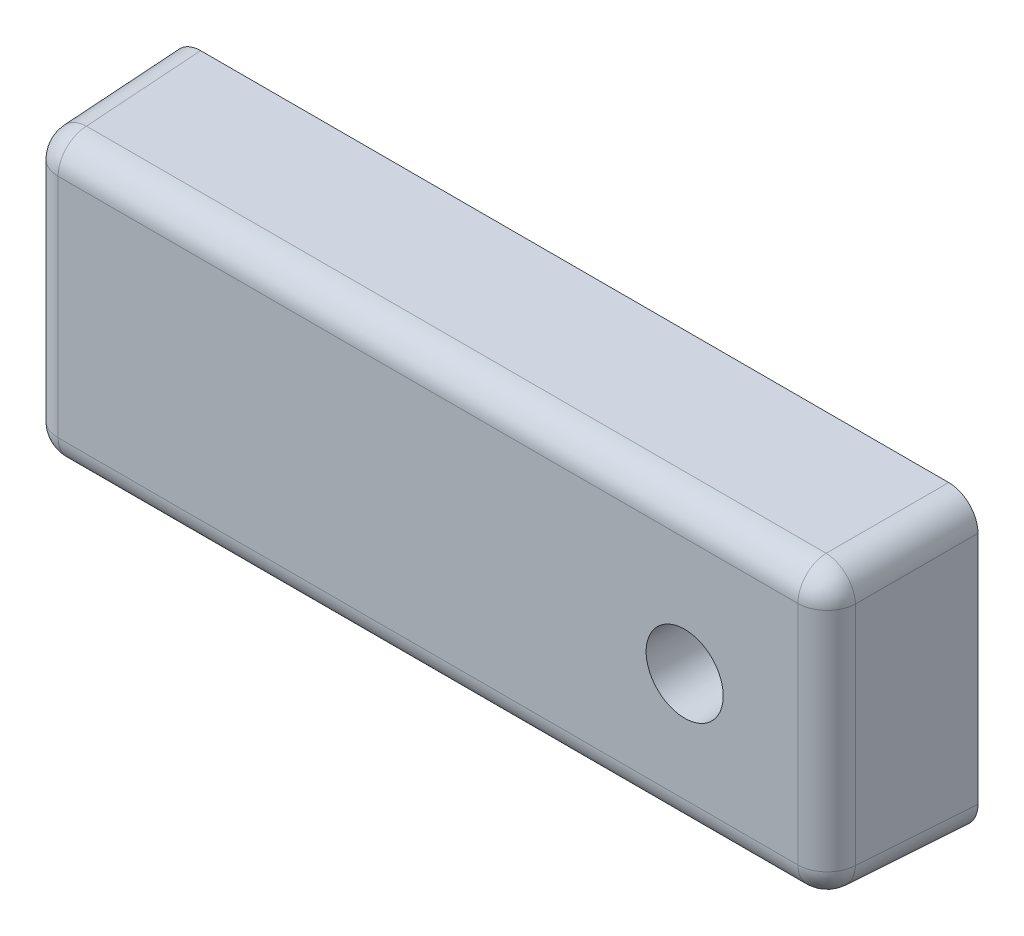
ISO-10303-21;
HEADER;
FILE_DESCRIPTION(('STEP AP214'),'2;1');
FILE_NAME('part.step','',(''),(''),'','','');
FILE_SCHEMA(('AUTOMOTIVE_DESIGN { 1 0 10303 214 1 1 1 1 }'));
ENDSEC;
DATA;
#1=APPLICATION_CONTEXT('core data for automotive mechanical design processes');
#2=APPLICATION_PROTOCOL_DEFINITION('international standard','automotive_design',2000,#1);
#3=PRODUCT_CONTEXT('',#1,'mechanical');
#4=PRODUCT('Part','Part','',(#3));
#5=PRODUCT_RELATED_PRODUCT_CATEGORY('part','',(#4));
#6=PRODUCT_DEFINITION_FORMATION('','',#4);
#7=PRODUCT_DEFINITION_CONTEXT('part definition',#1,'design');
#8=PRODUCT_DEFINITION('design','',#6,#7);
#9=PRODUCT_DEFINITION_SHAPE('','',#8);
#10=(LENGTH_UNIT() NAMED_UNIT(*) SI_UNIT(.MILLI.,.METRE.));
#11=(NAMED_UNIT(*) PLANE_ANGLE_UNIT() SI_UNIT($,.RADIAN.));
#12=(NAMED_UNIT(*) SI_UNIT($,.STERADIAN.) SOLID_ANGLE_UNIT());
#13=UNCERTAINTY_MEASURE_WITH_UNIT(LENGTH_MEASURE(1.E-05),#10,'distance_accuracy_value','');
#14=(GEOMETRIC_REPRESENTATION_CONTEXT(3) GLOBAL_UNCERTAINTY_ASSIGNED_CONTEXT((#13)) GLOBAL_UNIT_ASSIGNED_CONTEXT((#10,
#11,#12)) REPRESENTATION_CONTEXT('',''));
#15=CARTESIAN_POINT('',(0.,0.,0.));
#16=DIRECTION('',(0.,0.,1.));
#17=DIRECTION('',(1.,0.,0.));
#18=AXIS2_PLACEMENT_3D('',#15,#16,#17);
#19=CARTESIAN_POINT('',(0.,0.,10.));
#20=DIRECTION('',(0.,0.,1.));
#21=DIRECTION('',(1.,0.,0.));
#22=AXIS2_PLACEMENT_3D('',#19,#20,#21);
#23=PLANE('',#22);
#24=DIRECTION('',(0.,1.,0.));
#25=VECTOR('',#24,1.);
#26=CARTESIAN_POINT('',(-65.7194147554684,3.09968367996677,10.));
#27=LINE('',#26,#25);
#28=CARTESIAN_POINT('',(-65.7194147554684,20.4698907405177,10.));
#29=VERTEX_POINT('',#28);
#30=CARTESIAN_POINT('',(-65.7194147554684,5.03106122958092,10.));
#31=VERTEX_POINT('',#30);
#32=EDGE_CURVE('E149',#29,#31,#27,.F.);
#33=ORIENTED_EDGE('',*,*,#32,.T.);
#34=DIRECTION('',(-1.,0.,0.));
#35=VECTOR('',#34,1.);
#36=CARTESIAN_POINT('',(-13.3492076949175,5.03106122958093,10.));
#37=LINE('',#36,#35);
#38=CARTESIAN_POINT('',(-15.2805852445316,5.03106122958093,10.));
#39=VERTEX_POINT('',#38);
#40=EDGE_CURVE('E148',#31,#39,#37,.F.);
#41=ORIENTED_EDGE('',*,*,#40,.T.);
#42=DIRECTION('',(0.,-1.,0.));
#43=VECTOR('',#42,1.);
#44=CARTESIAN_POINT('',(-15.2805852445316,22.4012682901318,10.));
#45=LINE('',#44,#43);
#46=CARTESIAN_POINT('',(-15.2805852445316,20.4698907405177,10.));
#47=VERTEX_POINT('',#46);
#48=EDGE_CURVE('E135',#39,#47,#45,.F.);
#49=ORIENTED_EDGE('',*,*,#48,.T.);
#50=DIRECTION('',(1.,0.,0.));
#51=VECTOR('',#50,1.);
#52=CARTESIAN_POINT('',(-67.6507923050825,20.4698907405177,10.));
#53=LINE('',#52,#51);
#54=EDGE_CURVE('E145',#47,#29,#53,.F.);
#55=ORIENTED_EDGE('',*,*,#54,.T.);
#56=EDGE_LOOP('',(#33,#41,#49,#55));
#57=FACE_BOUND('',#56,.T.);
#58=CARTESIAN_POINT('',(-22.999786699697,12.458174308326,10.));
#59=DIRECTION('',(0.,0.,1.));
#60=DIRECTION('',(1.,0.,0.));
#61=AXIS2_PLACEMENT_3D('',#58,#59,#60);
#62=CIRCLE('',#61,2.62840366853749);
#63=CARTESIAN_POINT('',(-20.3713830311595,12.458174308326,10.));
#64=VERTEX_POINT('',#63);
#65=EDGE_CURVE('E159',#64,#64,#62,.T.);
#66=ORIENTED_EDGE('',*,*,#65,.F.);
#67=EDGE_LOOP('',(#66));
#68=FACE_BOUND('',#67,.T.);
#69=ADVANCED_FACE('F37',(#57,#68),#23,.T.);
#70=CARTESIAN_POINT('',(0.,0.,0.));
#71=DIRECTION('',(0.,0.,1.));
#72=DIRECTION('',(1.,0.,0.));
#73=AXIS2_PLACEMENT_3D('',#70,#71,#72);
#74=PLANE('',#73);
#75=DIRECTION('',(-1.,0.,0.));
#76=VECTOR('',#75,1.);
#77=CARTESIAN_POINT('',(-13.,22.7504759850493,0.));
#78=LINE('',#77,#76);
#79=CARTESIAN_POINT('',(-14.9987816540382,22.7504759850493,0.));
#80=VERTEX_POINT('',#79);
#81=CARTESIAN_POINT('',(-66.0012183459618,22.7504759850493,0.));
#82=VERTEX_POINT('',#81);
#83=EDGE_CURVE('E243',#80,#82,#78,.T.);
#84=ORIENTED_EDGE('',*,*,#83,.F.);
#85=CARTESIAN_POINT('',(-15.0012190885976,20.7492568964517,0.));
#86=DIRECTION('',(0.,0.,1.));
#87=DIRECTION('',(0.707106781186547,0.707106781186548,0.));
#88=AXIS2_PLACEMENT_3D('',#85,#86,#87);
#89=ELLIPSE('',#88,2.00243743501143,2.);
#90=CARTESIAN_POINT('',(-13.,20.7516943310111,0.));
#91=VERTEX_POINT('',#90);
#92=EDGE_CURVE('E192',#80,#91,#89,.F.);
#93=ORIENTED_EDGE('',*,*,#92,.T.);
#94=DIRECTION('',(0.,1.,0.));
#95=VECTOR('',#94,1.);
#96=CARTESIAN_POINT('',(-13.,2.7504759850493,0.));
#97=LINE('',#96,#95);
#98=CARTESIAN_POINT('',(-13.,4.74925763908749,0.));
#99=VERTEX_POINT('',#98);
#100=EDGE_CURVE('E234',#99,#91,#97,.T.);
#101=ORIENTED_EDGE('',*,*,#100,.F.);
#102=CARTESIAN_POINT('',(-15.0012190885976,4.75169507364695,0.));
#103=DIRECTION('',(0.,0.,1.));
#104=DIRECTION('',(0.707106781186548,-0.707106781186547,0.));
#105=AXIS2_PLACEMENT_3D('',#102,#103,#104);
#106=ELLIPSE('',#105,2.00243743501143,2.);
#107=CARTESIAN_POINT('',(-14.9987816540382,2.7504759850493,0.));
#108=VERTEX_POINT('',#107);
#109=EDGE_CURVE('E188',#99,#108,#106,.F.);
#110=ORIENTED_EDGE('',*,*,#109,.T.);
#111=DIRECTION('',(1.,0.,0.));
#112=VECTOR('',#111,1.);
#113=CARTESIAN_POINT('',(-13.,2.7504759850493,0.));
#114=LINE('',#113,#112);
#115=CARTESIAN_POINT('',(-66.0012183459618,2.7504759850493,0.));
#116=VERTEX_POINT('',#115);
#117=EDGE_CURVE('E153',#116,#108,#114,.T.);
#118=ORIENTED_EDGE('',*,*,#117,.F.);
#119=CARTESIAN_POINT('',(-65.9987809114023,4.75169507364694,0.));
#120=DIRECTION('',(0.,0.,1.));
#121=DIRECTION('',(-0.707106781186547,-0.707106781186548,0.));
#122=AXIS2_PLACEMENT_3D('',#119,#120,#121);
#123=ELLIPSE('',#122,2.00243743501143,2.);
#124=CARTESIAN_POINT('',(-68.,4.74925763908749,0.));
#125=VERTEX_POINT('',#124);
#126=EDGE_CURVE('E54',#116,#125,#123,.F.);
#127=ORIENTED_EDGE('',*,*,#126,.T.);
#128=DIRECTION('',(0.,-1.,0.));
#129=VECTOR('',#128,1.);
#130=CARTESIAN_POINT('',(-68.,2.7504759850493,0.));
#131=LINE('',#130,#129);
#132=CARTESIAN_POINT('',(-68.,20.7516943310111,0.));
#133=VERTEX_POINT('',#132);
#134=EDGE_CURVE('E156',#133,#125,#131,.T.);
#135=ORIENTED_EDGE('',*,*,#134,.F.);
#136=CARTESIAN_POINT('',(-65.9987809114024,20.7492568964517,0.));
#137=DIRECTION('',(0.,0.,1.));
#138=DIRECTION('',(-0.707106781186548,0.707106781186547,0.));
#139=AXIS2_PLACEMENT_3D('',#136,#137,#138);
#140=ELLIPSE('',#139,2.00243743501143,2.);
#141=EDGE_CURVE('E190',#133,#82,#140,.F.);
#142=ORIENTED_EDGE('',*,*,#141,.T.);
#143=EDGE_LOOP('',(#84,#93,#101,#110,#118,#127,#135,#142));
#144=FACE_BOUND('',#143,.T.);
#145=CARTESIAN_POINT('',(-22.999786699697,12.458174308326,0.));
#146=DIRECTION('',(0.,0.,1.));
#147=DIRECTION('',(1.,0.,0.));
#148=AXIS2_PLACEMENT_3D('',#145,#146,#147);
#149=CIRCLE('',#148,2.27919597362001);
#150=CARTESIAN_POINT('',(-20.720590726077,12.458174308326,0.));
#151=VERTEX_POINT('',#150);
#152=EDGE_CURVE('E203',#151,#151,#149,.T.);
#153=ORIENTED_EDGE('',*,*,#152,.T.);
#154=EDGE_LOOP('',(#153));
#155=FACE_BOUND('',#154,.T.);
#156=ADVANCED_FACE('F245',(#144,#155),#74,.F.);
#157=CARTESIAN_POINT('',(-13.,2.7504759850493,0.));
#158=DIRECTION('',(0.999390827019096,0.,0.034899496702501));
#159=DIRECTION('',(0.034899496702501,0.,-0.999390827019096));
#160=AXIS2_PLACEMENT_3D('',#157,#158,#159);
#161=PLANE('',#160);
#162=ORIENTED_EDGE('',*,*,#100,.T.);
#163=DIRECTION('',(-0.0348782627423747,-0.0348782627423747,0.998782765958718));
#164=VECTOR('',#163,1.);
#165=CARTESIAN_POINT('',(-13.0218983599243,20.7297959710869,0.627086981271629));
#166=LINE('',#165,#164);
#167=CARTESIAN_POINT('',(-13.2818035904934,20.4698907405177,8.069798993405));
#168=VERTEX_POINT('',#167);
#169=EDGE_CURVE('E196',#91,#168,#166,.T.);
#170=ORIENTED_EDGE('',*,*,#169,.T.);
#171=DIRECTION('',(0.,1.,0.));
#172=VECTOR('',#171,1.);
#173=CARTESIAN_POINT('',(-13.2818035904934,3.09968367996678,8.069798993405));
#174=LINE('',#173,#172);
#175=CARTESIAN_POINT('',(-13.2818035904934,5.03106122958093,8.069798993405));
#176=VERTEX_POINT('',#175);
#177=EDGE_CURVE('E138',#168,#176,#174,.F.);
#178=ORIENTED_EDGE('',*,*,#177,.T.);
#179=DIRECTION('',(-0.0348782627423747,0.0348782627423747,0.998782765958718));
#180=VECTOR('',#179,1.);
#181=CARTESIAN_POINT('',(-12.9975684956857,4.74682613477323,-0.069629173401649));
#182=LINE('',#181,#180);
#183=EDGE_CURVE('E194',#176,#99,#182,.F.);
#184=ORIENTED_EDGE('',*,*,#183,.T.);
#185=EDGE_LOOP('',(#162,#170,#178,#184));
#186=FACE_BOUND('',#185,.T.);
#187=ADVANCED_FACE('F231',(#186),#161,.T.);
#188=CARTESIAN_POINT('',(-13.,22.7504759850493,0.));
#189=DIRECTION('',(0.,0.999390827019096,0.034899496702501));
#190=DIRECTION('',(0.,-0.034899496702501,0.999390827019096));
#191=AXIS2_PLACEMENT_3D('',#188,#189,#190);
#192=PLANE('',#191);
#193=DIRECTION('',(-1.,0.,0.));
#194=VECTOR('',#193,1.);
#195=CARTESIAN_POINT('',(-13.3492076949175,22.4686723945559,8.069798993405));
#196=LINE('',#195,#194);
#197=CARTESIAN_POINT('',(-65.7194147554684,22.4686723945559,8.069798993405));
#198=VERTEX_POINT('',#197);
#199=CARTESIAN_POINT('',(-15.2805852445316,22.4686723945559,8.069798993405));
#200=VERTEX_POINT('',#199);
#201=EDGE_CURVE('E169',#198,#200,#196,.F.);
#202=ORIENTED_EDGE('',*,*,#201,.T.);
#203=DIRECTION('',(-0.0348782627423747,-0.0348782627423747,0.998782765958718));
#204=VECTOR('',#203,1.);
#205=CARTESIAN_POINT('',(-14.9963501497239,22.7529074893636,-0.0696291734016491));
#206=LINE('',#205,#204);
#207=EDGE_CURVE('E185',#200,#80,#206,.F.);
#208=ORIENTED_EDGE('',*,*,#207,.T.);
#209=ORIENTED_EDGE('',*,*,#83,.T.);
#210=DIRECTION('',(0.0348782627423747,-0.0348782627423746,0.998782765958718));
#211=VECTOR('',#210,1.);
#212=CARTESIAN_POINT('',(-65.9367427236201,22.6860003627076,1.84634025194986));
#213=LINE('',#212,#211);
#214=EDGE_CURVE('E183',#82,#198,#213,.T.);
#215=ORIENTED_EDGE('',*,*,#214,.T.);
#216=EDGE_LOOP('',(#202,#208,#209,#215));
#217=FACE_BOUND('',#216,.T.);
#218=ADVANCED_FACE('F242',(#217),#192,.T.);
#219=CARTESIAN_POINT('',(-68.,2.7504759850493,0.));
#220=DIRECTION('',(-0.999390827019096,0.,0.034899496702501));
#221=DIRECTION('',(0.034899496702501,0.,0.999390827019096));
#222=AXIS2_PLACEMENT_3D('',#219,#220,#221);
#223=PLANE('',#222);
#224=DIRECTION('',(0.,-1.,0.));
#225=VECTOR('',#224,1.);
#226=CARTESIAN_POINT('',(-67.7181964095066,22.4012682901318,8.069798993405));
#227=LINE('',#226,#225);
#228=CARTESIAN_POINT('',(-67.7181964095066,5.03106122958092,8.069798993405));
#229=VERTEX_POINT('',#228);
#230=CARTESIAN_POINT('',(-67.7181964095066,20.4698907405177,8.069798993405));
#231=VERTEX_POINT('',#230);
#232=EDGE_CURVE('E166',#229,#231,#227,.F.);
#233=ORIENTED_EDGE('',*,*,#232,.T.);
#234=DIRECTION('',(0.0348782627423747,-0.0348782627423747,0.998782765958718));
#235=VECTOR('',#234,1.);
#236=CARTESIAN_POINT('',(-67.9781016400757,20.7297959710868,0.627086981271628));
#237=LINE('',#236,#235);
#238=EDGE_CURVE('E61',#231,#133,#237,.F.);
#239=ORIENTED_EDGE('',*,*,#238,.T.);
#240=ORIENTED_EDGE('',*,*,#134,.T.);
#241=DIRECTION('',(0.0348782627423747,0.0348782627423747,0.998782765958718));
#242=VECTOR('',#241,1.);
#243=CARTESIAN_POINT('',(-68.0024315043143,4.74682613477323,-0.0696291734016491));
#244=LINE('',#243,#242);
#245=EDGE_CURVE('E198',#125,#229,#244,.T.);
#246=ORIENTED_EDGE('',*,*,#245,.T.);
#247=EDGE_LOOP('',(#233,#239,#240,#246));
#248=FACE_BOUND('',#247,.T.);
#249=ADVANCED_FACE('F270',(#248),#223,.T.);
#250=CARTESIAN_POINT('',(-13.,2.7504759850493,0.));
#251=DIRECTION('',(0.,-0.999390827019096,0.034899496702501));
#252=DIRECTION('',(0.,-0.034899496702501,-0.999390827019096));
#253=AXIS2_PLACEMENT_3D('',#250,#251,#252);
#254=PLANE('',#253);
#255=ORIENTED_EDGE('',*,*,#117,.T.);
#256=DIRECTION('',(-0.0348782627423747,0.0348782627423746,0.998782765958718));
#257=VECTOR('',#256,1.);
#258=CARTESIAN_POINT('',(-14.9963501497239,2.74804448073504,-0.0696291734016491));
#259=LINE('',#258,#257);
#260=CARTESIAN_POINT('',(-15.2805852445316,3.03227957554274,8.069798993405));
#261=VERTEX_POINT('',#260);
#262=EDGE_CURVE('E11',#108,#261,#259,.T.);
#263=ORIENTED_EDGE('',*,*,#262,.T.);
#264=DIRECTION('',(1.,0.,0.));
#265=VECTOR('',#264,1.);
#266=CARTESIAN_POINT('',(-67.6507923050825,3.03227957554273,8.069798993405));
#267=LINE('',#266,#265);
#268=CARTESIAN_POINT('',(-65.7194147554684,3.03227957554273,8.069798993405));
#269=VERTEX_POINT('',#268);
#270=EDGE_CURVE('E163',#261,#269,#267,.F.);
#271=ORIENTED_EDGE('',*,*,#270,.T.);
#272=DIRECTION('',(0.0348782627423747,0.0348782627423747,0.998782765958718));
#273=VECTOR('',#272,1.);
#274=CARTESIAN_POINT('',(-65.9367427236201,2.81495160739097,1.84634025194986));
#275=LINE('',#274,#273);
#276=EDGE_CURVE('E46',#269,#116,#275,.F.);
#277=ORIENTED_EDGE('',*,*,#276,.T.);
#278=EDGE_LOOP('',(#255,#263,#271,#277));
#279=FACE_BOUND('',#278,.T.);
#280=ADVANCED_FACE('F222',(#279),#254,.T.);
#281=CARTESIAN_POINT('',(-22.999786699697,12.458174308326,0.));
#282=DIRECTION('',(0.,0.,1.));
#283=DIRECTION('',(1.,0.,0.));
#284=AXIS2_PLACEMENT_3D('',#281,#282,#283);
#285=CONICAL_SURFACE('',#284,2.27919597362001,0.0349065850398866);
#286=ORIENTED_EDGE('',*,*,#65,.T.);
#287=EDGE_LOOP('',(#286));
#288=FACE_BOUND('',#287,.T.);
#289=ORIENTED_EDGE('',*,*,#152,.F.);
#290=EDGE_LOOP('',(#289));
#291=FACE_BOUND('',#290,.T.);
#292=ADVANCED_FACE('F257',(#288,#291),#285,.F.);
#293=CARTESIAN_POINT('',(0.,20.4698907405177,8.));
#294=DIRECTION('',(-1.,0.,0.));
#295=DIRECTION('',(0.,-1.,0.));
#296=AXIS2_PLACEMENT_3D('',#293,#294,#295);
#297=CYLINDRICAL_SURFACE('',#296,2.);
#298=ORIENTED_EDGE('',*,*,#54,.F.);
#299=CARTESIAN_POINT('',(-15.2805852445316,20.4698907405177,8.));
#300=DIRECTION('',(-1.,0.,0.));
#301=DIRECTION('',(0.,-1.,0.));
#302=AXIS2_PLACEMENT_3D('',#299,#300,#301);
#303=CIRCLE('',#302,2.);
#304=EDGE_CURVE('E117',#47,#200,#303,.T.);
#305=ORIENTED_EDGE('',*,*,#304,.T.);
#306=ORIENTED_EDGE('',*,*,#201,.F.);
#307=CARTESIAN_POINT('',(-65.7194147554683,20.4698907405177,8.));
#308=DIRECTION('',(-1.,0.,0.));
#309=DIRECTION('',(0.,-1.,0.));
#310=AXIS2_PLACEMENT_3D('',#307,#308,#309);
#311=CIRCLE('',#310,2.);
#312=EDGE_CURVE('E128',#198,#29,#311,.F.);
#313=ORIENTED_EDGE('',*,*,#312,.T.);
#314=EDGE_LOOP('',(#298,#305,#306,#313));
#315=FACE_BOUND('',#314,.T.);
#316=ADVANCED_FACE('F151',(#315),#297,.T.);
#317=CARTESIAN_POINT('',(-65.7194147554684,0.,8.));
#318=DIRECTION('',(0.,-1.,0.));
#319=DIRECTION('',(0.,0.,-1.));
#320=AXIS2_PLACEMENT_3D('',#317,#318,#319);
#321=CYLINDRICAL_SURFACE('',#320,2.);
#322=ORIENTED_EDGE('',*,*,#32,.F.);
#323=CARTESIAN_POINT('',(-65.7194147554684,20.4698907405177,8.));
#324=DIRECTION('',(0.,-1.,0.));
#325=DIRECTION('',(0.,0.,-1.));
#326=AXIS2_PLACEMENT_3D('',#323,#324,#325);
#327=CIRCLE('',#326,2.);
#328=EDGE_CURVE('E174',#29,#231,#327,.T.);
#329=ORIENTED_EDGE('',*,*,#328,.T.);
#330=ORIENTED_EDGE('',*,*,#232,.F.);
#331=CARTESIAN_POINT('',(-65.7194147554684,5.03106122958092,8.));
#332=DIRECTION('',(0.,-1.,0.));
#333=DIRECTION('',(0.,0.,-1.));
#334=AXIS2_PLACEMENT_3D('',#331,#332,#333);
#335=CIRCLE('',#334,2.);
#336=EDGE_CURVE('E127',#229,#31,#335,.F.);
#337=ORIENTED_EDGE('',*,*,#336,.T.);
#338=EDGE_LOOP('',(#322,#329,#330,#337));
#339=FACE_BOUND('',#338,.T.);
#340=ADVANCED_FACE('F281',(#339),#321,.T.);
#341=CARTESIAN_POINT('',(-15.2805852445316,0.,8.));
#342=DIRECTION('',(0.,1.,0.));
#343=DIRECTION('',(0.,0.,1.));
#344=AXIS2_PLACEMENT_3D('',#341,#342,#343);
#345=CYLINDRICAL_SURFACE('',#344,2.);
#346=ORIENTED_EDGE('',*,*,#177,.F.);
#347=CARTESIAN_POINT('',(-15.2805852445316,20.4698907405177,8.));
#348=DIRECTION('',(0.,1.,0.));
#349=DIRECTION('',(0.,0.,1.));
#350=AXIS2_PLACEMENT_3D('',#347,#348,#349);
#351=CIRCLE('',#350,2.);
#352=EDGE_CURVE('E120',#168,#47,#351,.F.);
#353=ORIENTED_EDGE('',*,*,#352,.T.);
#354=ORIENTED_EDGE('',*,*,#48,.F.);
#355=CARTESIAN_POINT('',(-15.2805852445316,5.03106122958093,8.));
#356=DIRECTION('',(0.,1.,0.));
#357=DIRECTION('',(0.,0.,1.));
#358=AXIS2_PLACEMENT_3D('',#355,#356,#357);
#359=CIRCLE('',#358,2.);
#360=EDGE_CURVE('E139',#39,#176,#359,.T.);
#361=ORIENTED_EDGE('',*,*,#360,.T.);
#362=EDGE_LOOP('',(#346,#353,#354,#361));
#363=FACE_BOUND('',#362,.T.);
#364=ADVANCED_FACE('F134',(#363),#345,.T.);
#365=CARTESIAN_POINT('',(0.,5.03106122958093,8.));
#366=DIRECTION('',(1.,0.,0.));
#367=DIRECTION('',(0.,1.,0.));
#368=AXIS2_PLACEMENT_3D('',#365,#366,#367);
#369=CYLINDRICAL_SURFACE('',#368,2.);
#370=ORIENTED_EDGE('',*,*,#270,.F.);
#371=CARTESIAN_POINT('',(-15.2805852445316,5.03106122958093,8.));
#372=DIRECTION('',(1.,0.,0.));
#373=DIRECTION('',(0.,1.,0.));
#374=AXIS2_PLACEMENT_3D('',#371,#372,#373);
#375=CIRCLE('',#374,2.);
#376=EDGE_CURVE('E180',#261,#39,#375,.F.);
#377=ORIENTED_EDGE('',*,*,#376,.T.);
#378=ORIENTED_EDGE('',*,*,#40,.F.);
#379=CARTESIAN_POINT('',(-65.7194147554684,5.03106122958092,8.));
#380=DIRECTION('',(1.,0.,0.));
#381=DIRECTION('',(0.,1.,0.));
#382=AXIS2_PLACEMENT_3D('',#379,#380,#381);
#383=CIRCLE('',#382,2.);
#384=EDGE_CURVE('E177',#31,#269,#383,.T.);
#385=ORIENTED_EDGE('',*,*,#384,.T.);
#386=EDGE_LOOP('',(#370,#377,#378,#385));
#387=FACE_BOUND('',#386,.T.);
#388=ADVANCED_FACE('F221',(#387),#369,.T.);
#389=CARTESIAN_POINT('',(-14.9963501497239,20.7541258353254,-0.139428166806651));
#390=DIRECTION('',(0.0348782627423747,0.0348782627423747,-0.998782765958718));
#391=DIRECTION('',(0.,0.999390827019096,0.034899496702501));
#392=AXIS2_PLACEMENT_3D('',#389,#390,#391);
#393=CYLINDRICAL_SURFACE('',#392,2.);
#394=ORIENTED_EDGE('',*,*,#92,.F.);
#395=ORIENTED_EDGE('',*,*,#207,.F.);
#396=CARTESIAN_POINT('',(-15.2805852445316,20.4698907405177,8.));
#397=DIRECTION('',(-0.0348782627423745,-0.0348782627423746,0.998782765958718));
#398=DIRECTION('',(0.,-0.999390827019096,-0.034899496702501));
#399=AXIS2_PLACEMENT_3D('',#396,#397,#398);
#400=CIRCLE('',#399,2.);
#401=EDGE_CURVE('E122',#168,#200,#400,.T.);
#402=ORIENTED_EDGE('',*,*,#401,.F.);
#403=ORIENTED_EDGE('',*,*,#169,.F.);
#404=EDGE_LOOP('',(#394,#395,#402,#403));
#405=FACE_BOUND('',#404,.T.);
#406=ADVANCED_FACE('F237',(#405),#393,.T.);
#407=CARTESIAN_POINT('',(-15.2805852445316,20.4698907405177,8.));
#408=DIRECTION('',(0.,0.,1.));
#409=DIRECTION('',(1.,0.,0.));
#410=AXIS2_PLACEMENT_3D('',#407,#408,#409);
#411=SPHERICAL_SURFACE('',#410,2.);
#412=ORIENTED_EDGE('',*,*,#401,.T.);
#413=ORIENTED_EDGE('',*,*,#304,.F.);
#414=ORIENTED_EDGE('',*,*,#352,.F.);
#415=EDGE_LOOP('',(#412,#413,#414));
#416=FACE_BOUND('',#415,.T.);
#417=ADVANCED_FACE('F119',(#416),#411,.T.);
#418=CARTESIAN_POINT('',(-65.9793199860376,20.7297959710868,0.557287987866626));
#419=DIRECTION('',(-0.0348782627423747,0.0348782627423747,-0.998782765958718));
#420=DIRECTION('',(-0.999390827019096,0.,0.034899496702501));
#421=AXIS2_PLACEMENT_3D('',#418,#419,#420);
#422=CYLINDRICAL_SURFACE('',#421,2.);
#423=ORIENTED_EDGE('',*,*,#141,.F.);
#424=ORIENTED_EDGE('',*,*,#238,.F.);
#425=CARTESIAN_POINT('',(-65.7194147554684,20.4698907405177,8.));
#426=DIRECTION('',(0.0348782627423746,-0.0348782627423745,0.998782765958718));
#427=DIRECTION('',(0.999390827019096,0.,-0.0348994967025009));
#428=AXIS2_PLACEMENT_3D('',#425,#426,#427);
#429=CIRCLE('',#428,2.);
#430=EDGE_CURVE('E204',#198,#231,#429,.T.);
#431=ORIENTED_EDGE('',*,*,#430,.F.);
#432=ORIENTED_EDGE('',*,*,#214,.F.);
#433=EDGE_LOOP('',(#423,#424,#431,#432));
#434=FACE_BOUND('',#433,.T.);
#435=ADVANCED_FACE('F289',(#434),#422,.T.);
#436=CARTESIAN_POINT('',(-65.7194147554684,20.4698907405177,8.));
#437=DIRECTION('',(0.,0.,1.));
#438=DIRECTION('',(1.,0.,0.));
#439=AXIS2_PLACEMENT_3D('',#436,#437,#438);
#440=SPHERICAL_SURFACE('',#439,2.);
#441=ORIENTED_EDGE('',*,*,#328,.F.);
#442=ORIENTED_EDGE('',*,*,#312,.F.);
#443=ORIENTED_EDGE('',*,*,#430,.T.);
#444=EDGE_LOOP('',(#441,#442,#443));
#445=FACE_BOUND('',#444,.T.);
#446=ADVANCED_FACE('F292',(#445),#440,.T.);
#447=CARTESIAN_POINT('',(-14.9963501497239,4.74682613477323,-0.139428166806651));
#448=DIRECTION('',(0.0348782627423747,-0.0348782627423747,-0.998782765958718));
#449=DIRECTION('',(-0.999390827019096,0.,-0.034899496702501));
#450=AXIS2_PLACEMENT_3D('',#447,#448,#449);
#451=CYLINDRICAL_SURFACE('',#450,2.);
#452=ORIENTED_EDGE('',*,*,#109,.F.);
#453=ORIENTED_EDGE('',*,*,#183,.F.);
#454=CARTESIAN_POINT('',(-15.2805852445316,5.03106122958093,8.));
#455=DIRECTION('',(-0.0348782627423745,0.0348782627423745,0.998782765958718));
#456=DIRECTION('',(0.,-0.999390827019096,0.0348994967025009));
#457=AXIS2_PLACEMENT_3D('',#454,#455,#456);
#458=CIRCLE('',#457,2.);
#459=EDGE_CURVE('E205',#261,#176,#458,.T.);
#460=ORIENTED_EDGE('',*,*,#459,.F.);
#461=ORIENTED_EDGE('',*,*,#262,.F.);
#462=EDGE_LOOP('',(#452,#453,#460,#461));
#463=FACE_BOUND('',#462,.T.);
#464=ADVANCED_FACE('F226',(#463),#451,.T.);
#465=CARTESIAN_POINT('',(-15.2805852445316,5.03106122958093,8.));
#466=DIRECTION('',(0.,0.,1.));
#467=DIRECTION('',(1.,0.,0.));
#468=AXIS2_PLACEMENT_3D('',#465,#466,#467);
#469=SPHERICAL_SURFACE('',#468,2.);
#470=ORIENTED_EDGE('',*,*,#459,.T.);
#471=ORIENTED_EDGE('',*,*,#360,.F.);
#472=ORIENTED_EDGE('',*,*,#376,.F.);
#473=EDGE_LOOP('',(#470,#471,#472));
#474=FACE_BOUND('',#473,.T.);
#475=ADVANCED_FACE('F228',(#474),#469,.T.);
#476=CARTESIAN_POINT('',(-65.9367427236201,4.81373326142916,1.77654125854486));
#477=DIRECTION('',(-0.0348782627423747,-0.0348782627423747,-0.998782765958718));
#478=DIRECTION('',(0.,0.999390827019096,-0.034899496702501));
#479=AXIS2_PLACEMENT_3D('',#476,#477,#478);
#480=CYLINDRICAL_SURFACE('',#479,2.);
#481=ORIENTED_EDGE('',*,*,#126,.F.);
#482=ORIENTED_EDGE('',*,*,#276,.F.);
#483=CARTESIAN_POINT('',(-65.7194147554684,5.03106122958092,8.));
#484=DIRECTION('',(0.0348782627423746,0.0348782627423748,0.998782765958718));
#485=DIRECTION('',(0.,-0.999390827019096,0.0348994967025011));
#486=AXIS2_PLACEMENT_3D('',#483,#484,#485);
#487=CIRCLE('',#486,2.);
#488=EDGE_CURVE('E41',#229,#269,#487,.T.);
#489=ORIENTED_EDGE('',*,*,#488,.F.);
#490=ORIENTED_EDGE('',*,*,#245,.F.);
#491=EDGE_LOOP('',(#481,#482,#489,#490));
#492=FACE_BOUND('',#491,.T.);
#493=ADVANCED_FACE('F39',(#492),#480,.T.);
#494=CARTESIAN_POINT('',(-65.7194147554684,5.03106122958092,8.));
#495=DIRECTION('',(0.,0.,1.));
#496=DIRECTION('',(1.,0.,0.));
#497=AXIS2_PLACEMENT_3D('',#494,#495,#496);
#498=SPHERICAL_SURFACE('',#497,2.);
#499=ORIENTED_EDGE('',*,*,#384,.F.);
#500=ORIENTED_EDGE('',*,*,#336,.F.);
#501=ORIENTED_EDGE('',*,*,#488,.T.);
#502=EDGE_LOOP('',(#499,#500,#501));
#503=FACE_BOUND('',#502,.T.);
#504=ADVANCED_FACE('F215',(#503),#498,.T.);
#505=CLOSED_SHELL('',(#69,#156,#187,#218,#249,#280,#292,#316,#340,#364,#388,#406,#417,#435,#446,
#464,#475,#493,#504));
#506=MANIFOLD_SOLID_BREP('B2',#505);
#507=ADVANCED_BREP_SHAPE_REPRESENTATION('',(#18,#506),#14);
#508=SHAPE_DEFINITION_REPRESENTATION(#9,#507);
ENDSEC;
END-ISO-10303-21;
